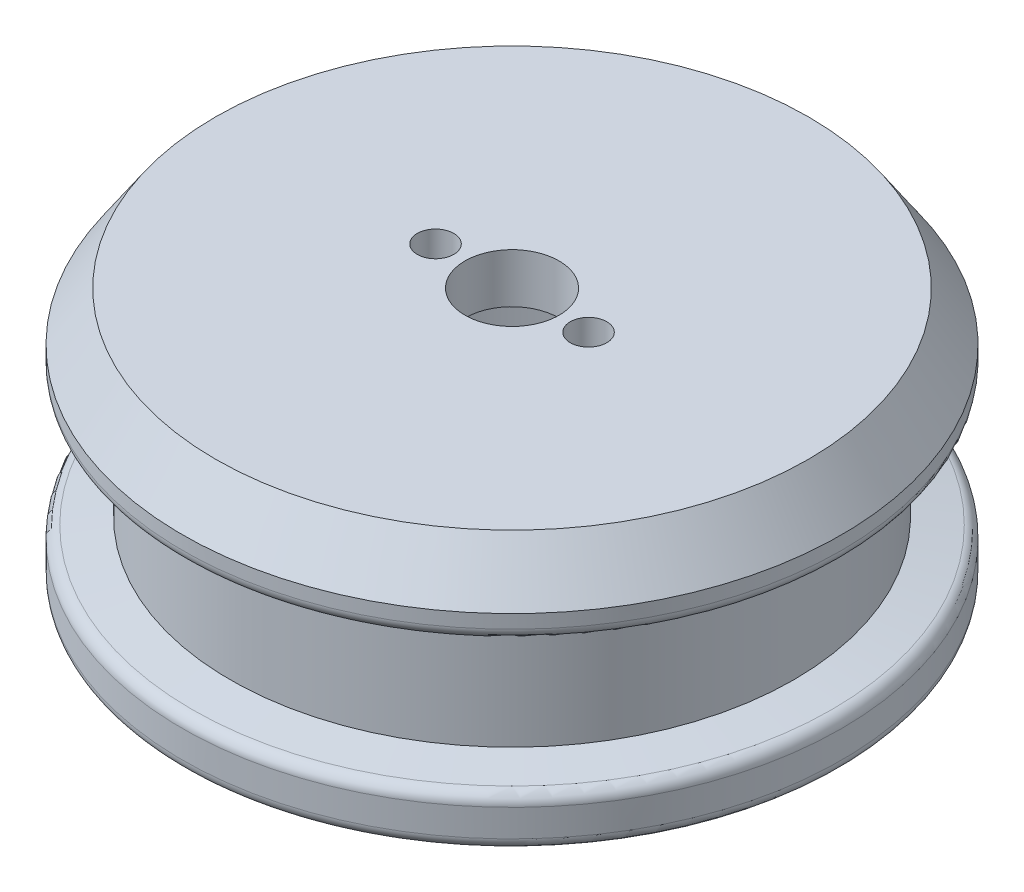
ISO-10303-21;
HEADER;
FILE_DESCRIPTION(('STEP AP214'),'2;1');
FILE_NAME('part.step','',(''),(''),'','','');
FILE_SCHEMA(('AUTOMOTIVE_DESIGN { 1 0 10303 214 1 1 1 1 }'));
ENDSEC;
DATA;
#1=APPLICATION_CONTEXT('core data for automotive mechanical design processes');
#2=APPLICATION_PROTOCOL_DEFINITION('international standard','automotive_design',2000,#1);
#3=PRODUCT_CONTEXT('',#1,'mechanical');
#4=PRODUCT('Part','Part','',(#3));
#5=PRODUCT_RELATED_PRODUCT_CATEGORY('part','',(#4));
#6=PRODUCT_DEFINITION_FORMATION('','',#4);
#7=PRODUCT_DEFINITION_CONTEXT('part definition',#1,'design');
#8=PRODUCT_DEFINITION('design','',#6,#7);
#9=PRODUCT_DEFINITION_SHAPE('','',#8);
#10=(LENGTH_UNIT() NAMED_UNIT(*) SI_UNIT(.MILLI.,.METRE.));
#11=(NAMED_UNIT(*) PLANE_ANGLE_UNIT() SI_UNIT($,.RADIAN.));
#12=(NAMED_UNIT(*) SI_UNIT($,.STERADIAN.) SOLID_ANGLE_UNIT());
#13=UNCERTAINTY_MEASURE_WITH_UNIT(LENGTH_MEASURE(1.E-05),#10,'distance_accuracy_value','');
#14=(GEOMETRIC_REPRESENTATION_CONTEXT(3) GLOBAL_UNCERTAINTY_ASSIGNED_CONTEXT((#13)) GLOBAL_UNIT_ASSIGNED_CONTEXT((#10,
#11,#12)) REPRESENTATION_CONTEXT('',''));
#15=CARTESIAN_POINT('',(0.,0.,0.));
#16=DIRECTION('',(0.,0.,1.));
#17=DIRECTION('',(1.,0.,0.));
#18=AXIS2_PLACEMENT_3D('',#15,#16,#17);
#19=CARTESIAN_POINT('',(0.,76.906520747834,0.));
#20=DIRECTION('',(0.,1.,0.));
#21=DIRECTION('',(-1.,0.,0.));
#22=AXIS2_PLACEMENT_3D('',#19,#20,#21);
#23=CYLINDRICAL_SURFACE('',#22,28.);
#24=CARTESIAN_POINT('',(0.,34.7209319374927,0.));
#25=DIRECTION('',(0.,1.,0.));
#26=DIRECTION('',(-1.,0.,0.));
#27=AXIS2_PLACEMENT_3D('',#24,#25,#26);
#28=CIRCLE('',#27,28.);
#29=CARTESIAN_POINT('',(-28.,34.7209319374927,0.));
#30=VERTEX_POINT('',#29);
#31=EDGE_CURVE('E45',#30,#30,#28,.T.);
#32=ORIENTED_EDGE('',*,*,#31,.T.);
#33=EDGE_LOOP('',(#32));
#34=FACE_BOUND('',#33,.T.);
#35=CARTESIAN_POINT('',(0.,37.0407723425527,0.));
#36=DIRECTION('',(0.,-1.,0.));
#37=DIRECTION('',(1.,0.,0.));
#38=AXIS2_PLACEMENT_3D('',#35,#36,#37);
#39=CIRCLE('',#38,28.);
#40=CARTESIAN_POINT('',(28.,37.0407723425527,0.));
#41=VERTEX_POINT('',#40);
#42=EDGE_CURVE('E50',#41,#41,#39,.T.);
#43=ORIENTED_EDGE('',*,*,#42,.T.);
#44=EDGE_LOOP('',(#43));
#45=FACE_BOUND('',#44,.T.);
#46=ADVANCED_FACE('F37',(#34,#45),#23,.T.);
#47=CARTESIAN_POINT('',(0.,37.87987197373,0.));
#48=DIRECTION('',(0.,-1.,0.));
#49=DIRECTION('',(1.,0.,0.));
#50=AXIS2_PLACEMENT_3D('',#47,#48,#49);
#51=CONICAL_SURFACE('',#50,28.,1.39626340159546);
#52=CARTESIAN_POINT('',(0.,38.0255800955649,0.));
#53=DIRECTION('',(0.,1.,0.));
#54=DIRECTION('',(-1.,0.,0.));
#55=AXIS2_PLACEMENT_3D('',#52,#53,#54);
#56=CIRCLE('',#55,27.1736481776669);
#57=CARTESIAN_POINT('',(-27.1736481776669,38.0255800955649,0.));
#58=VERTEX_POINT('',#57);
#59=EDGE_CURVE('E55',#58,#58,#56,.T.);
#60=ORIENTED_EDGE('',*,*,#59,.T.);
#61=EDGE_LOOP('',(#60));
#62=FACE_BOUND('',#61,.T.);
#63=CARTESIAN_POINT('',(0.,38.5959319374927,0.));
#64=DIRECTION('',(0.,1.,0.));
#65=DIRECTION('',(-1.,0.,0.));
#66=AXIS2_PLACEMENT_3D('',#63,#64,#65);
#67=CIRCLE('',#66,23.9390221457567);
#68=CARTESIAN_POINT('',(-23.9390221457567,38.5959319374927,0.));
#69=VERTEX_POINT('',#68);
#70=EDGE_CURVE('E69',#69,#69,#67,.T.);
#71=ORIENTED_EDGE('',*,*,#70,.F.);
#72=EDGE_LOOP('',(#71));
#73=FACE_BOUND('',#72,.T.);
#74=ADVANCED_FACE('F154',(#62,#73),#51,.T.);
#75=CARTESIAN_POINT('',(0.,76.906520747834,0.));
#76=DIRECTION('',(0.,1.,0.));
#77=DIRECTION('',(-1.,0.,0.));
#78=AXIS2_PLACEMENT_3D('',#75,#76,#77);
#79=CYLINDRICAL_SURFACE('',#78,23.9390221457567);
#80=CARTESIAN_POINT('',(0.,48.5959319374927,0.));
#81=DIRECTION('',(0.,1.,0.));
#82=DIRECTION('',(-1.,0.,0.));
#83=AXIS2_PLACEMENT_3D('',#80,#81,#82);
#84=CIRCLE('',#83,23.9390221457567);
#85=CARTESIAN_POINT('',(-23.9390221457567,48.5959319374927,0.));
#86=VERTEX_POINT('',#85);
#87=EDGE_CURVE('E83',#86,#86,#84,.T.);
#88=ORIENTED_EDGE('',*,*,#87,.F.);
#89=EDGE_LOOP('',(#88));
#90=FACE_BOUND('',#89,.T.);
#91=ORIENTED_EDGE('',*,*,#70,.T.);
#92=EDGE_LOOP('',(#91));
#93=FACE_BOUND('',#92,.T.);
#94=ADVANCED_FACE('F150',(#90,#93),#79,.T.);
#95=CARTESIAN_POINT('',(0.,48.5959319374927,0.));
#96=DIRECTION('',(0.,1.,0.));
#97=DIRECTION('',(-1.,0.,0.));
#98=AXIS2_PLACEMENT_3D('',#95,#96,#97);
#99=CONICAL_SURFACE('',#98,23.9390221457567,1.39626340159546);
#100=CARTESIAN_POINT('',(0.,49.1662837794204,0.));
#101=DIRECTION('',(0.,-1.,0.));
#102=DIRECTION('',(1.,0.,0.));
#103=AXIS2_PLACEMENT_3D('',#100,#101,#102);
#104=CIRCLE('',#103,27.1736481776669);
#105=CARTESIAN_POINT('',(27.1736481776669,49.1662837794204,0.));
#106=VERTEX_POINT('',#105);
#107=EDGE_CURVE('E61',#106,#106,#104,.T.);
#108=ORIENTED_EDGE('',*,*,#107,.T.);
#109=EDGE_LOOP('',(#108));
#110=FACE_BOUND('',#109,.T.);
#111=ORIENTED_EDGE('',*,*,#87,.T.);
#112=EDGE_LOOP('',(#111));
#113=FACE_BOUND('',#112,.T.);
#114=ADVANCED_FACE('F144',(#110,#113),#99,.T.);
#115=CARTESIAN_POINT('',(0.,76.906520747834,0.));
#116=DIRECTION('',(0.,1.,0.));
#117=DIRECTION('',(-1.,0.,0.));
#118=AXIS2_PLACEMENT_3D('',#115,#116,#117);
#119=CYLINDRICAL_SURFACE('',#118,28.);
#120=CARTESIAN_POINT('',(0.,50.1510915324326,0.));
#121=DIRECTION('',(0.,-1.,0.));
#122=DIRECTION('',(1.,0.,0.));
#123=AXIS2_PLACEMENT_3D('',#120,#121,#122);
#124=CIRCLE('',#123,28.);
#125=CARTESIAN_POINT('',(28.,50.1510915324326,0.));
#126=VERTEX_POINT('',#125);
#127=EDGE_CURVE('E65',#126,#126,#124,.F.);
#128=ORIENTED_EDGE('',*,*,#127,.T.);
#129=EDGE_LOOP('',(#128));
#130=FACE_BOUND('',#129,.T.);
#131=CARTESIAN_POINT('',(0.,51.2996739552229,0.));
#132=DIRECTION('',(0.,1.,0.));
#133=DIRECTION('',(-1.,0.,0.));
#134=AXIS2_PLACEMENT_3D('',#131,#132,#133);
#135=CIRCLE('',#134,28.);
#136=CARTESIAN_POINT('',(-28.,51.2996739552229,0.));
#137=VERTEX_POINT('',#136);
#138=EDGE_CURVE('E87',#137,#137,#135,.T.);
#139=ORIENTED_EDGE('',*,*,#138,.F.);
#140=EDGE_LOOP('',(#139));
#141=FACE_BOUND('',#140,.T.);
#142=ADVANCED_FACE('F139',(#130,#141),#119,.T.);
#143=CARTESIAN_POINT('',(0.,51.2996739552229,0.));
#144=DIRECTION('',(0.,-1.,0.));
#145=DIRECTION('',(1.,0.,0.));
#146=AXIS2_PLACEMENT_3D('',#143,#144,#145);
#147=CONICAL_SURFACE('',#146,28.,0.593761011528468);
#148=CARTESIAN_POINT('',(0.,55.4569609880009,0.));
#149=DIRECTION('',(0.,1.,0.));
#150=DIRECTION('',(-1.,0.,0.));
#151=AXIS2_PLACEMENT_3D('',#148,#149,#150);
#152=CIRCLE('',#151,25.1937625997414);
#153=CARTESIAN_POINT('',(-25.1937625997414,55.4569609880009,0.));
#154=VERTEX_POINT('',#153);
#155=EDGE_CURVE('E91',#154,#154,#152,.T.);
#156=ORIENTED_EDGE('',*,*,#155,.F.);
#157=EDGE_LOOP('',(#156));
#158=FACE_BOUND('',#157,.T.);
#159=ORIENTED_EDGE('',*,*,#138,.T.);
#160=EDGE_LOOP('',(#159));
#161=FACE_BOUND('',#160,.T.);
#162=ADVANCED_FACE('F129',(#158,#161),#147,.T.);
#163=CARTESIAN_POINT('',(4.,55.4569609880009,0.));
#164=DIRECTION('',(0.,-1.,0.));
#165=DIRECTION('',(1.,0.,0.));
#166=AXIS2_PLACEMENT_3D('',#163,#164,#165);
#167=PLANE('',#166);
#168=CARTESIAN_POINT('',(-6.50000000000001,55.4569609880009,0.));
#169=DIRECTION('',(0.,1.,0.));
#170=DIRECTION('',(0.,0.,1.));
#171=AXIS2_PLACEMENT_3D('',#168,#169,#170);
#172=CIRCLE('',#171,1.55);
#173=CARTESIAN_POINT('',(-6.50000000000001,55.4569609880009,1.55));
#174=VERTEX_POINT('',#173);
#175=EDGE_CURVE('E79',#174,#174,#172,.T.);
#176=ORIENTED_EDGE('',*,*,#175,.F.);
#177=EDGE_LOOP('',(#176));
#178=FACE_BOUND('',#177,.T.);
#179=CARTESIAN_POINT('',(6.49999999999999,55.4569609880009,0.));
#180=DIRECTION('',(0.,1.,0.));
#181=DIRECTION('',(0.,0.,-1.));
#182=AXIS2_PLACEMENT_3D('',#179,#180,#181);
#183=CIRCLE('',#182,1.55);
#184=CARTESIAN_POINT('',(6.49999999999999,55.4569609880009,-1.55));
#185=VERTEX_POINT('',#184);
#186=EDGE_CURVE('E114',#185,#185,#183,.T.);
#187=ORIENTED_EDGE('',*,*,#186,.F.);
#188=EDGE_LOOP('',(#187));
#189=FACE_BOUND('',#188,.T.);
#190=CARTESIAN_POINT('',(0.,55.4569609880009,0.));
#191=DIRECTION('',(0.,1.,0.));
#192=DIRECTION('',(-1.,0.,0.));
#193=AXIS2_PLACEMENT_3D('',#190,#191,#192);
#194=CIRCLE('',#193,4.);
#195=CARTESIAN_POINT('',(-4.,55.4569609880009,0.));
#196=VERTEX_POINT('',#195);
#197=EDGE_CURVE('E95',#196,#196,#194,.T.);
#198=ORIENTED_EDGE('',*,*,#197,.F.);
#199=EDGE_LOOP('',(#198));
#200=FACE_BOUND('',#199,.T.);
#201=ORIENTED_EDGE('',*,*,#155,.T.);
#202=EDGE_LOOP('',(#201));
#203=FACE_BOUND('',#202,.T.);
#204=ADVANCED_FACE('F125',(#178,#189,#200,#203),#167,.F.);
#205=CARTESIAN_POINT('',(0.,76.906520747834,0.));
#206=DIRECTION('',(0.,1.,0.));
#207=DIRECTION('',(-1.,0.,0.));
#208=AXIS2_PLACEMENT_3D('',#205,#206,#207);
#209=CYLINDRICAL_SURFACE('',#208,4.);
#210=CARTESIAN_POINT('',(0.,51.2569213732005,0.));
#211=DIRECTION('',(0.,1.,0.));
#212=DIRECTION('',(-1.,0.,0.));
#213=AXIS2_PLACEMENT_3D('',#210,#211,#212);
#214=CIRCLE('',#213,4.);
#215=CARTESIAN_POINT('',(-4.,51.2569213732005,0.));
#216=VERTEX_POINT('',#215);
#217=EDGE_CURVE('E99',#216,#216,#214,.T.);
#218=ORIENTED_EDGE('',*,*,#217,.F.);
#219=EDGE_LOOP('',(#218));
#220=FACE_BOUND('',#219,.T.);
#221=ORIENTED_EDGE('',*,*,#197,.T.);
#222=EDGE_LOOP('',(#221));
#223=FACE_BOUND('',#222,.T.);
#224=ADVANCED_FACE('F128',(#220,#223),#209,.F.);
#225=CARTESIAN_POINT('',(4.,51.2569213732005,0.));
#226=DIRECTION('',(0.,1.,0.));
#227=DIRECTION('',(-1.,0.,0.));
#228=AXIS2_PLACEMENT_3D('',#225,#226,#227);
#229=PLANE('',#228);
#230=CARTESIAN_POINT('',(-6.50000000000001,51.2569213732005,0.));
#231=DIRECTION('',(0.,1.,0.));
#232=DIRECTION('',(-1.,0.,0.));
#233=AXIS2_PLACEMENT_3D('',#230,#231,#232);
#234=CIRCLE('',#233,1.55);
#235=CARTESIAN_POINT('',(-8.05000000000001,51.2569213732005,0.));
#236=VERTEX_POINT('',#235);
#237=EDGE_CURVE('E70',#236,#236,#234,.T.);
#238=ORIENTED_EDGE('',*,*,#237,.T.);
#239=EDGE_LOOP('',(#238));
#240=FACE_BOUND('',#239,.T.);
#241=CARTESIAN_POINT('',(6.49999999999999,51.2569213732005,0.));
#242=DIRECTION('',(0.,1.,0.));
#243=DIRECTION('',(-1.,0.,0.));
#244=AXIS2_PLACEMENT_3D('',#241,#242,#243);
#245=CIRCLE('',#244,1.55);
#246=CARTESIAN_POINT('',(4.94999999999999,51.2569213732005,0.));
#247=VERTEX_POINT('',#246);
#248=EDGE_CURVE('E75',#247,#247,#245,.T.);
#249=ORIENTED_EDGE('',*,*,#248,.T.);
#250=EDGE_LOOP('',(#249));
#251=FACE_BOUND('',#250,.T.);
#252=CARTESIAN_POINT('',(0.,51.2569213732005,0.));
#253=DIRECTION('',(0.,1.,0.));
#254=DIRECTION('',(-1.,0.,0.));
#255=AXIS2_PLACEMENT_3D('',#252,#253,#254);
#256=CIRCLE('',#255,18.3);
#257=CARTESIAN_POINT('',(-18.3,51.2569213732005,0.));
#258=VERTEX_POINT('',#257);
#259=EDGE_CURVE('E103',#258,#258,#256,.T.);
#260=ORIENTED_EDGE('',*,*,#259,.F.);
#261=EDGE_LOOP('',(#260));
#262=FACE_BOUND('',#261,.T.);
#263=ORIENTED_EDGE('',*,*,#217,.T.);
#264=EDGE_LOOP('',(#263));
#265=FACE_BOUND('',#264,.T.);
#266=ADVANCED_FACE('F262',(#240,#251,#262,#265),#229,.F.);
#267=CARTESIAN_POINT('',(0.,51.2569213732005,0.));
#268=DIRECTION('',(0.,-1.,0.));
#269=DIRECTION('',(1.,0.,0.));
#270=AXIS2_PLACEMENT_3D('',#267,#268,#269);
#271=CONICAL_SURFACE('',#270,18.3,0.593761011528468);
#272=CARTESIAN_POINT('',(0.,45.7755739933026,0.));
#273=DIRECTION('',(0.,1.,0.));
#274=DIRECTION('',(-1.,0.,0.));
#275=AXIS2_PLACEMENT_3D('',#272,#273,#274);
#276=CIRCLE('',#275,22.);
#277=CARTESIAN_POINT('',(-22.,45.7755739933026,0.));
#278=VERTEX_POINT('',#277);
#279=EDGE_CURVE('E107',#278,#278,#276,.T.);
#280=ORIENTED_EDGE('',*,*,#279,.F.);
#281=EDGE_LOOP('',(#280));
#282=FACE_BOUND('',#281,.T.);
#283=ORIENTED_EDGE('',*,*,#259,.T.);
#284=EDGE_LOOP('',(#283));
#285=FACE_BOUND('',#284,.T.);
#286=ADVANCED_FACE('F259',(#282,#285),#271,.F.);
#287=CARTESIAN_POINT('',(0.,76.906520747834,0.));
#288=DIRECTION('',(0.,1.,0.));
#289=DIRECTION('',(-1.,0.,0.));
#290=AXIS2_PLACEMENT_3D('',#287,#288,#289);
#291=CYLINDRICAL_SURFACE('',#290,22.);
#292=CARTESIAN_POINT('',(0.,33.7209319374927,0.));
#293=DIRECTION('',(0.,1.,0.));
#294=DIRECTION('',(-1.,0.,0.));
#295=AXIS2_PLACEMENT_3D('',#292,#293,#294);
#296=CIRCLE('',#295,22.);
#297=CARTESIAN_POINT('',(-22.,33.7209319374927,0.));
#298=VERTEX_POINT('',#297);
#299=EDGE_CURVE('E74',#298,#298,#296,.T.);
#300=ORIENTED_EDGE('',*,*,#299,.F.);
#301=EDGE_LOOP('',(#300));
#302=FACE_BOUND('',#301,.T.);
#303=ORIENTED_EDGE('',*,*,#279,.T.);
#304=EDGE_LOOP('',(#303));
#305=FACE_BOUND('',#304,.T.);
#306=ADVANCED_FACE('F234',(#302,#305),#291,.F.);
#307=CARTESIAN_POINT('',(22.,33.7209319374927,0.));
#308=DIRECTION('',(0.,1.,0.));
#309=DIRECTION('',(-1.,0.,0.));
#310=AXIS2_PLACEMENT_3D('',#307,#308,#309);
#311=PLANE('',#310);
#312=CARTESIAN_POINT('',(0.,33.7209319374927,0.));
#313=DIRECTION('',(0.,1.,0.));
#314=DIRECTION('',(-1.,0.,0.));
#315=AXIS2_PLACEMENT_3D('',#312,#313,#314);
#316=CIRCLE('',#315,27.);
#317=CARTESIAN_POINT('',(-27.,33.7209319374927,0.));
#318=VERTEX_POINT('',#317);
#319=EDGE_CURVE('E10',#318,#318,#316,.F.);
#320=ORIENTED_EDGE('',*,*,#319,.T.);
#321=EDGE_LOOP('',(#320));
#322=FACE_BOUND('',#321,.T.);
#323=ORIENTED_EDGE('',*,*,#299,.T.);
#324=EDGE_LOOP('',(#323));
#325=FACE_BOUND('',#324,.T.);
#326=ADVANCED_FACE('F228',(#322,#325),#311,.F.);
#327=CARTESIAN_POINT('',(6.49999999999999,45.4569609880009,0.));
#328=DIRECTION('',(0.,1.,0.));
#329=DIRECTION('',(0.,0.,1.));
#330=AXIS2_PLACEMENT_3D('',#327,#328,#329);
#331=CYLINDRICAL_SURFACE('',#330,1.55);
#332=ORIENTED_EDGE('',*,*,#186,.T.);
#333=EDGE_LOOP('',(#332));
#334=FACE_BOUND('',#333,.T.);
#335=ORIENTED_EDGE('',*,*,#248,.F.);
#336=EDGE_LOOP('',(#335));
#337=FACE_BOUND('',#336,.T.);
#338=ADVANCED_FACE('F233',(#334,#337),#331,.F.);
#339=CARTESIAN_POINT('',(-6.50000000000001,45.4569609880009,0.));
#340=DIRECTION('',(0.,1.,0.));
#341=DIRECTION('',(0.,0.,1.));
#342=AXIS2_PLACEMENT_3D('',#339,#340,#341);
#343=CYLINDRICAL_SURFACE('',#342,1.55);
#344=ORIENTED_EDGE('',*,*,#175,.T.);
#345=EDGE_LOOP('',(#344));
#346=FACE_BOUND('',#345,.T.);
#347=ORIENTED_EDGE('',*,*,#237,.F.);
#348=EDGE_LOOP('',(#347));
#349=FACE_BOUND('',#348,.T.);
#350=ADVANCED_FACE('F122',(#346,#349),#343,.F.);
#351=CARTESIAN_POINT('',(0.,50.1510915324326,0.));
#352=DIRECTION('',(0.,-1.,0.));
#353=DIRECTION('',(1.,0.,0.));
#354=AXIS2_PLACEMENT_3D('',#351,#352,#353);
#355=TOROIDAL_SURFACE('',#354,27.,1.);
#356=ORIENTED_EDGE('',*,*,#107,.F.);
#357=EDGE_LOOP('',(#356));
#358=FACE_BOUND('',#357,.T.);
#359=ORIENTED_EDGE('',*,*,#127,.F.);
#360=EDGE_LOOP('',(#359));
#361=FACE_BOUND('',#360,.T.);
#362=ADVANCED_FACE('F164',(#358,#361),#355,.T.);
#363=CARTESIAN_POINT('',(0.,37.0407723425527,0.));
#364=DIRECTION('',(0.,-1.,0.));
#365=DIRECTION('',(1.,0.,0.));
#366=AXIS2_PLACEMENT_3D('',#363,#364,#365);
#367=TOROIDAL_SURFACE('',#366,27.,1.);
#368=ORIENTED_EDGE('',*,*,#42,.F.);
#369=EDGE_LOOP('',(#368));
#370=FACE_BOUND('',#369,.T.);
#371=ORIENTED_EDGE('',*,*,#59,.F.);
#372=EDGE_LOOP('',(#371));
#373=FACE_BOUND('',#372,.T.);
#374=ADVANCED_FACE('F166',(#370,#373),#367,.T.);
#375=CARTESIAN_POINT('',(0.,34.7209319374927,0.));
#376=DIRECTION('',(0.,1.,0.));
#377=DIRECTION('',(-1.,0.,0.));
#378=AXIS2_PLACEMENT_3D('',#375,#376,#377);
#379=TOROIDAL_SURFACE('',#378,27.,1.);
#380=ORIENTED_EDGE('',*,*,#319,.F.);
#381=EDGE_LOOP('',(#380));
#382=FACE_BOUND('',#381,.T.);
#383=ORIENTED_EDGE('',*,*,#31,.F.);
#384=EDGE_LOOP('',(#383));
#385=FACE_BOUND('',#384,.T.);
#386=ADVANCED_FACE('F39',(#382,#385),#379,.T.);
#387=CLOSED_SHELL('',(#46,#74,#94,#114,#142,#162,#204,#224,#266,#286,#306,#326,#338,#350,#362,
#374,#386));
#388=MANIFOLD_SOLID_BREP('B2',#387);
#389=ADVANCED_BREP_SHAPE_REPRESENTATION('',(#18,#388),#14);
#390=SHAPE_DEFINITION_REPRESENTATION(#9,#389);
ENDSEC;
END-ISO-10303-21;
